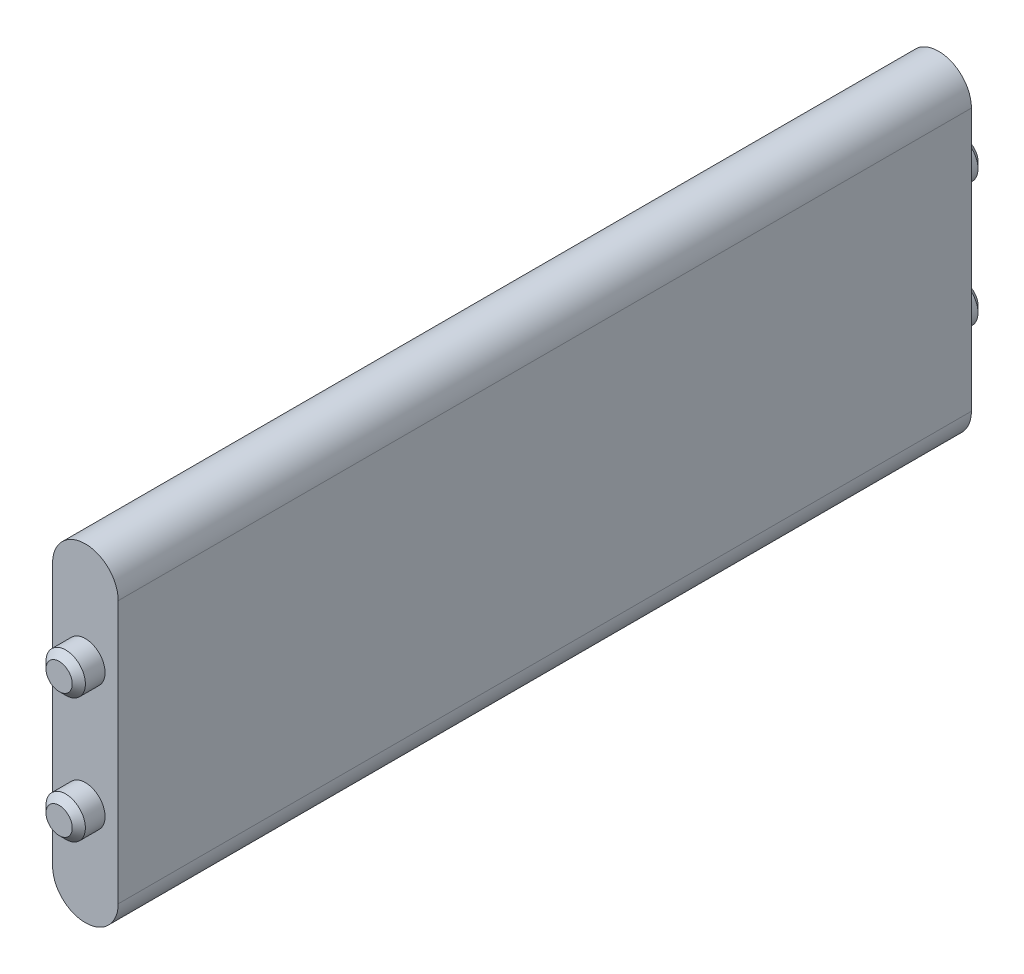
ISO-10303-21;
HEADER;
FILE_DESCRIPTION(('STEP AP214'),'2;1');
FILE_NAME('part.step','',(''),(''),'','','');
FILE_SCHEMA(('AUTOMOTIVE_DESIGN { 1 0 10303 214 1 1 1 1 }'));
ENDSEC;
DATA;
#1=APPLICATION_CONTEXT('core data for automotive mechanical design processes');
#2=APPLICATION_PROTOCOL_DEFINITION('international standard','automotive_design',2000,#1);
#3=PRODUCT_CONTEXT('',#1,'mechanical');
#4=PRODUCT('Part','Part','',(#3));
#5=PRODUCT_RELATED_PRODUCT_CATEGORY('part','',(#4));
#6=PRODUCT_DEFINITION_FORMATION('','',#4);
#7=PRODUCT_DEFINITION_CONTEXT('part definition',#1,'design');
#8=PRODUCT_DEFINITION('design','',#6,#7);
#9=PRODUCT_DEFINITION_SHAPE('','',#8);
#10=(LENGTH_UNIT() NAMED_UNIT(*) SI_UNIT(.MILLI.,.METRE.));
#11=(NAMED_UNIT(*) PLANE_ANGLE_UNIT() SI_UNIT($,.RADIAN.));
#12=(NAMED_UNIT(*) SI_UNIT($,.STERADIAN.) SOLID_ANGLE_UNIT());
#13=UNCERTAINTY_MEASURE_WITH_UNIT(LENGTH_MEASURE(1.E-05),#10,'distance_accuracy_value','');
#14=(GEOMETRIC_REPRESENTATION_CONTEXT(3) GLOBAL_UNCERTAINTY_ASSIGNED_CONTEXT((#13)) GLOBAL_UNIT_ASSIGNED_CONTEXT((#10,
#11,#12)) REPRESENTATION_CONTEXT('',''));
#15=CARTESIAN_POINT('',(0.,0.,0.));
#16=DIRECTION('',(0.,0.,1.));
#17=DIRECTION('',(1.,0.,0.));
#18=AXIS2_PLACEMENT_3D('',#15,#16,#17);
#19=CARTESIAN_POINT('',(0.,20.,65.));
#20=DIRECTION('',(0.,0.,-1.));
#21=DIRECTION('',(-1.,0.,0.));
#22=AXIS2_PLACEMENT_3D('',#19,#20,#21);
#23=PLANE('',#22);
#24=CARTESIAN_POINT('',(0.,9.5,65.));
#25=DIRECTION('',(0.,0.,-1.));
#26=DIRECTION('',(-1.,0.,0.));
#27=AXIS2_PLACEMENT_3D('',#24,#25,#26);
#28=CIRCLE('',#27,3.);
#29=CARTESIAN_POINT('',(-3.,9.5,65.));
#30=VERTEX_POINT('',#29);
#31=EDGE_CURVE('E107',#30,#30,#28,.F.);
#32=ORIENTED_EDGE('',*,*,#31,.F.);
#33=EDGE_LOOP('',(#32));
#34=FACE_BOUND('',#33,.T.);
#35=CARTESIAN_POINT('',(0.,20.,65.));
#36=DIRECTION('',(0.,0.,1.));
#37=DIRECTION('',(-1.,0.,0.));
#38=AXIS2_PLACEMENT_3D('',#35,#36,#37);
#39=CIRCLE('',#38,5.);
#40=CARTESIAN_POINT('',(5.,20.,65.));
#41=VERTEX_POINT('',#40);
#42=CARTESIAN_POINT('',(-5.,20.,65.));
#43=VERTEX_POINT('',#42);
#44=EDGE_CURVE('E83',#41,#43,#39,.T.);
#45=ORIENTED_EDGE('',*,*,#44,.T.);
#46=DIRECTION('',(0.,-1.,0.));
#47=VECTOR('',#46,1.);
#48=CARTESIAN_POINT('',(-5.,20.,65.));
#49=LINE('',#48,#47);
#50=CARTESIAN_POINT('',(-4.99999999999999,-20.,65.));
#51=VERTEX_POINT('',#50);
#52=EDGE_CURVE('E78',#43,#51,#49,.T.);
#53=ORIENTED_EDGE('',*,*,#52,.T.);
#54=CARTESIAN_POINT('',(0.,-20.,65.));
#55=DIRECTION('',(0.,0.,1.));
#56=DIRECTION('',(1.,0.,0.));
#57=AXIS2_PLACEMENT_3D('',#54,#55,#56);
#58=CIRCLE('',#57,5.);
#59=CARTESIAN_POINT('',(4.99999999999999,-20.,65.));
#60=VERTEX_POINT('',#59);
#61=EDGE_CURVE('E81',#51,#60,#58,.T.);
#62=ORIENTED_EDGE('',*,*,#61,.T.);
#63=DIRECTION('',(0.,1.,0.));
#64=VECTOR('',#63,1.);
#65=CARTESIAN_POINT('',(5.,20.,65.));
#66=LINE('',#65,#64);
#67=EDGE_CURVE('E47',#60,#41,#66,.T.);
#68=ORIENTED_EDGE('',*,*,#67,.T.);
#69=EDGE_LOOP('',(#45,#53,#62,#68));
#70=FACE_BOUND('',#69,.T.);
#71=CARTESIAN_POINT('',(0.,-9.5,65.));
#72=DIRECTION('',(0.,0.,-1.));
#73=DIRECTION('',(-1.,0.,0.));
#74=AXIS2_PLACEMENT_3D('',#71,#72,#73);
#75=CIRCLE('',#74,3.);
#76=CARTESIAN_POINT('',(-3.,-9.5,65.));
#77=VERTEX_POINT('',#76);
#78=EDGE_CURVE('E110',#77,#77,#75,.F.);
#79=ORIENTED_EDGE('',*,*,#78,.F.);
#80=EDGE_LOOP('',(#79));
#81=FACE_BOUND('',#80,.T.);
#82=ADVANCED_FACE('F30',(#34,#70,#81),#23,.F.);
#83=CARTESIAN_POINT('',(0.,20.,65.));
#84=DIRECTION('',(0.,0.,-1.));
#85=DIRECTION('',(-1.,0.,0.));
#86=AXIS2_PLACEMENT_3D('',#83,#84,#85);
#87=CYLINDRICAL_SURFACE('',#86,5.);
#88=CARTESIAN_POINT('',(0.,20.,-65.));
#89=DIRECTION('',(0.,0.,1.));
#90=DIRECTION('',(-1.,0.,0.));
#91=AXIS2_PLACEMENT_3D('',#88,#89,#90);
#92=CIRCLE('',#91,5.);
#93=CARTESIAN_POINT('',(5.,20.,-65.));
#94=VERTEX_POINT('',#93);
#95=CARTESIAN_POINT('',(-5.,20.,-65.));
#96=VERTEX_POINT('',#95);
#97=EDGE_CURVE('E98',#94,#96,#92,.T.);
#98=ORIENTED_EDGE('',*,*,#97,.T.);
#99=DIRECTION('',(0.,0.,-1.));
#100=VECTOR('',#99,1.);
#101=CARTESIAN_POINT('',(-5.,20.,65.));
#102=LINE('',#101,#100);
#103=EDGE_CURVE('E89',#43,#96,#102,.T.);
#104=ORIENTED_EDGE('',*,*,#103,.F.);
#105=ORIENTED_EDGE('',*,*,#44,.F.);
#106=DIRECTION('',(0.,0.,-1.));
#107=VECTOR('',#106,1.);
#108=CARTESIAN_POINT('',(5.,20.,65.));
#109=LINE('',#108,#107);
#110=EDGE_CURVE('E94',#41,#94,#109,.T.);
#111=ORIENTED_EDGE('',*,*,#110,.T.);
#112=EDGE_LOOP('',(#98,#104,#105,#111));
#113=FACE_BOUND('',#112,.T.);
#114=ADVANCED_FACE('F152',(#113),#87,.T.);
#115=CARTESIAN_POINT('',(-5.,20.,65.));
#116=DIRECTION('',(1.,0.,0.));
#117=DIRECTION('',(0.,1.,0.));
#118=AXIS2_PLACEMENT_3D('',#115,#116,#117);
#119=PLANE('',#118);
#120=DIRECTION('',(0.,-1.,0.));
#121=VECTOR('',#120,1.);
#122=CARTESIAN_POINT('',(-5.,20.,-65.));
#123=LINE('',#122,#121);
#124=CARTESIAN_POINT('',(-4.99999999999999,-20.,-65.));
#125=VERTEX_POINT('',#124);
#126=EDGE_CURVE('E88',#96,#125,#123,.T.);
#127=ORIENTED_EDGE('',*,*,#126,.T.);
#128=DIRECTION('',(0.,0.,-1.));
#129=VECTOR('',#128,1.);
#130=CARTESIAN_POINT('',(-4.99999999999999,-20.,65.));
#131=LINE('',#130,#129);
#132=EDGE_CURVE('E86',#51,#125,#131,.T.);
#133=ORIENTED_EDGE('',*,*,#132,.F.);
#134=ORIENTED_EDGE('',*,*,#52,.F.);
#135=ORIENTED_EDGE('',*,*,#103,.T.);
#136=EDGE_LOOP('',(#127,#133,#134,#135));
#137=FACE_BOUND('',#136,.T.);
#138=ADVANCED_FACE('F87',(#137),#119,.F.);
#139=CARTESIAN_POINT('',(0.,-20.,65.));
#140=DIRECTION('',(0.,0.,-1.));
#141=DIRECTION('',(-1.,0.,0.));
#142=AXIS2_PLACEMENT_3D('',#139,#140,#141);
#143=CYLINDRICAL_SURFACE('',#142,5.);
#144=CARTESIAN_POINT('',(0.,-20.,-65.));
#145=DIRECTION('',(0.,0.,1.));
#146=DIRECTION('',(1.,0.,0.));
#147=AXIS2_PLACEMENT_3D('',#144,#145,#146);
#148=CIRCLE('',#147,5.);
#149=CARTESIAN_POINT('',(4.99999999999999,-20.,-65.));
#150=VERTEX_POINT('',#149);
#151=EDGE_CURVE('E64',#125,#150,#148,.T.);
#152=ORIENTED_EDGE('',*,*,#151,.T.);
#153=DIRECTION('',(0.,0.,-1.));
#154=VECTOR('',#153,1.);
#155=CARTESIAN_POINT('',(4.99999999999999,-20.,65.));
#156=LINE('',#155,#154);
#157=EDGE_CURVE('E90',#60,#150,#156,.T.);
#158=ORIENTED_EDGE('',*,*,#157,.F.);
#159=ORIENTED_EDGE('',*,*,#61,.F.);
#160=ORIENTED_EDGE('',*,*,#132,.T.);
#161=EDGE_LOOP('',(#152,#158,#159,#160));
#162=FACE_BOUND('',#161,.T.);
#163=ADVANCED_FACE('F92',(#162),#143,.T.);
#164=CARTESIAN_POINT('',(5.,20.,65.));
#165=DIRECTION('',(-1.,0.,0.));
#166=DIRECTION('',(0.,-1.,0.));
#167=AXIS2_PLACEMENT_3D('',#164,#165,#166);
#168=PLANE('',#167);
#169=DIRECTION('',(0.,1.,0.));
#170=VECTOR('',#169,1.);
#171=CARTESIAN_POINT('',(5.,20.,-65.));
#172=LINE('',#171,#170);
#173=EDGE_CURVE('E70',#150,#94,#172,.T.);
#174=ORIENTED_EDGE('',*,*,#173,.T.);
#175=ORIENTED_EDGE('',*,*,#110,.F.);
#176=ORIENTED_EDGE('',*,*,#67,.F.);
#177=ORIENTED_EDGE('',*,*,#157,.T.);
#178=EDGE_LOOP('',(#174,#175,#176,#177));
#179=FACE_BOUND('',#178,.T.);
#180=ADVANCED_FACE('F168',(#179),#168,.F.);
#181=CARTESIAN_POINT('',(0.,20.,-65.));
#182=DIRECTION('',(0.,0.,-1.));
#183=DIRECTION('',(-1.,0.,0.));
#184=AXIS2_PLACEMENT_3D('',#181,#182,#183);
#185=PLANE('',#184);
#186=CARTESIAN_POINT('',(0.,-9.5,-65.));
#187=DIRECTION('',(0.,0.,-1.));
#188=DIRECTION('',(-1.,0.,0.));
#189=AXIS2_PLACEMENT_3D('',#186,#187,#188);
#190=CIRCLE('',#189,3.);
#191=CARTESIAN_POINT('',(-3.,-9.5,-65.));
#192=VERTEX_POINT('',#191);
#193=EDGE_CURVE('E128',#192,#192,#190,.T.);
#194=ORIENTED_EDGE('',*,*,#193,.F.);
#195=EDGE_LOOP('',(#194));
#196=FACE_BOUND('',#195,.T.);
#197=CARTESIAN_POINT('',(0.,9.5,-65.));
#198=DIRECTION('',(0.,0.,-1.));
#199=DIRECTION('',(-1.,0.,0.));
#200=AXIS2_PLACEMENT_3D('',#197,#198,#199);
#201=CIRCLE('',#200,3.);
#202=CARTESIAN_POINT('',(-3.,9.5,-65.));
#203=VERTEX_POINT('',#202);
#204=EDGE_CURVE('E125',#203,#203,#201,.T.);
#205=ORIENTED_EDGE('',*,*,#204,.F.);
#206=EDGE_LOOP('',(#205));
#207=FACE_BOUND('',#206,.T.);
#208=ORIENTED_EDGE('',*,*,#97,.F.);
#209=ORIENTED_EDGE('',*,*,#173,.F.);
#210=ORIENTED_EDGE('',*,*,#151,.F.);
#211=ORIENTED_EDGE('',*,*,#126,.F.);
#212=EDGE_LOOP('',(#208,#209,#210,#211));
#213=FACE_BOUND('',#212,.T.);
#214=ADVANCED_FACE('F165',(#196,#207,#213),#185,.T.);
#215=CARTESIAN_POINT('',(0.,9.5,69.));
#216=DIRECTION('',(0.,0.,-1.));
#217=DIRECTION('',(-1.,0.,0.));
#218=AXIS2_PLACEMENT_3D('',#215,#216,#217);
#219=CYLINDRICAL_SURFACE('',#218,3.);
#220=CARTESIAN_POINT('',(0.,9.5,68.));
#221=DIRECTION('',(0.,0.,1.));
#222=DIRECTION('',(1.,0.,0.));
#223=AXIS2_PLACEMENT_3D('',#220,#221,#222);
#224=CIRCLE('',#223,3.);
#225=CARTESIAN_POINT('',(3.,9.5,68.));
#226=VERTEX_POINT('',#225);
#227=EDGE_CURVE('E122',#226,#226,#224,.F.);
#228=ORIENTED_EDGE('',*,*,#227,.T.);
#229=EDGE_LOOP('',(#228));
#230=FACE_BOUND('',#229,.T.);
#231=ORIENTED_EDGE('',*,*,#31,.T.);
#232=EDGE_LOOP('',(#231));
#233=FACE_BOUND('',#232,.T.);
#234=ADVANCED_FACE('F163',(#230,#233),#219,.T.);
#235=CARTESIAN_POINT('',(0.,9.5,69.));
#236=DIRECTION('',(0.,0.,1.));
#237=DIRECTION('',(1.,0.,0.));
#238=AXIS2_PLACEMENT_3D('',#235,#236,#237);
#239=PLANE('',#238);
#240=CARTESIAN_POINT('',(0.,9.5,69.));
#241=DIRECTION('',(0.,0.,1.));
#242=DIRECTION('',(1.,0.,0.));
#243=AXIS2_PLACEMENT_3D('',#240,#241,#242);
#244=CIRCLE('',#243,2.00000000000002);
#245=CARTESIAN_POINT('',(2.00000000000002,9.5,69.));
#246=VERTEX_POINT('',#245);
#247=EDGE_CURVE('E119',#246,#246,#244,.T.);
#248=ORIENTED_EDGE('',*,*,#247,.T.);
#249=EDGE_LOOP('',(#248));
#250=FACE_BOUND('',#249,.T.);
#251=ADVANCED_FACE('F193',(#250),#239,.T.);
#252=CARTESIAN_POINT('',(0.,-9.5,69.));
#253=DIRECTION('',(0.,0.,-1.));
#254=DIRECTION('',(-1.,0.,0.));
#255=AXIS2_PLACEMENT_3D('',#252,#253,#254);
#256=CYLINDRICAL_SURFACE('',#255,3.);
#257=CARTESIAN_POINT('',(0.,-9.5,68.));
#258=DIRECTION('',(0.,0.,-1.));
#259=DIRECTION('',(-1.,0.,0.));
#260=AXIS2_PLACEMENT_3D('',#257,#258,#259);
#261=CIRCLE('',#260,3.);
#262=CARTESIAN_POINT('',(-3.,-9.5,68.));
#263=VERTEX_POINT('',#262);
#264=EDGE_CURVE('E116',#263,#263,#261,.T.);
#265=ORIENTED_EDGE('',*,*,#264,.T.);
#266=EDGE_LOOP('',(#265));
#267=FACE_BOUND('',#266,.T.);
#268=ORIENTED_EDGE('',*,*,#78,.T.);
#269=EDGE_LOOP('',(#268));
#270=FACE_BOUND('',#269,.T.);
#271=ADVANCED_FACE('F195',(#267,#270),#256,.T.);
#272=CARTESIAN_POINT('',(0.,-9.5,69.));
#273=DIRECTION('',(0.,0.,-1.));
#274=DIRECTION('',(-1.,0.,0.));
#275=AXIS2_PLACEMENT_3D('',#272,#273,#274);
#276=PLANE('',#275);
#277=CARTESIAN_POINT('',(0.,-9.5,69.));
#278=DIRECTION('',(0.,0.,-1.));
#279=DIRECTION('',(-1.,0.,0.));
#280=AXIS2_PLACEMENT_3D('',#277,#278,#279);
#281=CIRCLE('',#280,2.00000000000002);
#282=CARTESIAN_POINT('',(-2.00000000000002,-9.5,69.));
#283=VERTEX_POINT('',#282);
#284=EDGE_CURVE('E113',#283,#283,#281,.F.);
#285=ORIENTED_EDGE('',*,*,#284,.T.);
#286=EDGE_LOOP('',(#285));
#287=FACE_BOUND('',#286,.T.);
#288=ADVANCED_FACE('F180',(#287),#276,.F.);
#289=CARTESIAN_POINT('',(0.,-9.5,69.));
#290=DIRECTION('',(0.,0.,-1.));
#291=DIRECTION('',(-1.,0.,0.));
#292=AXIS2_PLACEMENT_3D('',#289,#290,#291);
#293=CONICAL_SURFACE('',#292,2.00000000000002,0.785398163397447);
#294=ORIENTED_EDGE('',*,*,#264,.F.);
#295=EDGE_LOOP('',(#294));
#296=FACE_BOUND('',#295,.T.);
#297=ORIENTED_EDGE('',*,*,#284,.F.);
#298=EDGE_LOOP('',(#297));
#299=FACE_BOUND('',#298,.T.);
#300=ADVANCED_FACE('F176',(#296,#299),#293,.T.);
#301=CARTESIAN_POINT('',(0.,9.5,69.));
#302=DIRECTION('',(0.,0.,-1.));
#303=DIRECTION('',(-1.,0.,0.));
#304=AXIS2_PLACEMENT_3D('',#301,#302,#303);
#305=CONICAL_SURFACE('',#304,2.00000000000002,0.785398163397447);
#306=ORIENTED_EDGE('',*,*,#227,.F.);
#307=EDGE_LOOP('',(#306));
#308=FACE_BOUND('',#307,.T.);
#309=ORIENTED_EDGE('',*,*,#247,.F.);
#310=EDGE_LOOP('',(#309));
#311=FACE_BOUND('',#310,.T.);
#312=ADVANCED_FACE('F179',(#308,#311),#305,.T.);
#313=CARTESIAN_POINT('',(0.,9.5,-69.));
#314=DIRECTION('',(0.,0.,1.));
#315=DIRECTION('',(1.,0.,0.));
#316=AXIS2_PLACEMENT_3D('',#313,#314,#315);
#317=CYLINDRICAL_SURFACE('',#316,3.);
#318=CARTESIAN_POINT('',(0.,9.5,-68.));
#319=DIRECTION('',(0.,0.,-1.));
#320=DIRECTION('',(-1.,0.,0.));
#321=AXIS2_PLACEMENT_3D('',#318,#319,#320);
#322=CIRCLE('',#321,3.);
#323=CARTESIAN_POINT('',(-3.,9.5,-68.));
#324=VERTEX_POINT('',#323);
#325=EDGE_CURVE('E39',#324,#324,#322,.F.);
#326=ORIENTED_EDGE('',*,*,#325,.T.);
#327=EDGE_LOOP('',(#326));
#328=FACE_BOUND('',#327,.T.);
#329=ORIENTED_EDGE('',*,*,#204,.T.);
#330=EDGE_LOOP('',(#329));
#331=FACE_BOUND('',#330,.T.);
#332=ADVANCED_FACE('F139',(#328,#331),#317,.T.);
#333=CARTESIAN_POINT('',(0.,9.5,-69.));
#334=DIRECTION('',(0.,0.,-1.));
#335=DIRECTION('',(1.,0.,0.));
#336=AXIS2_PLACEMENT_3D('',#333,#334,#335);
#337=PLANE('',#336);
#338=CARTESIAN_POINT('',(0.,9.5,-69.));
#339=DIRECTION('',(0.,0.,-1.));
#340=DIRECTION('',(-1.,0.,0.));
#341=AXIS2_PLACEMENT_3D('',#338,#339,#340);
#342=CIRCLE('',#341,1.99999999999999);
#343=CARTESIAN_POINT('',(-1.99999999999999,9.5,-69.));
#344=VERTEX_POINT('',#343);
#345=EDGE_CURVE('E11',#344,#344,#342,.T.);
#346=ORIENTED_EDGE('',*,*,#345,.T.);
#347=EDGE_LOOP('',(#346));
#348=FACE_BOUND('',#347,.T.);
#349=ADVANCED_FACE('F187',(#348),#337,.T.);
#350=CARTESIAN_POINT('',(0.,-9.5,-69.));
#351=DIRECTION('',(0.,0.,1.));
#352=DIRECTION('',(1.,0.,0.));
#353=AXIS2_PLACEMENT_3D('',#350,#351,#352);
#354=CYLINDRICAL_SURFACE('',#353,3.);
#355=CARTESIAN_POINT('',(0.,-9.5,-68.));
#356=DIRECTION('',(0.,0.,1.));
#357=DIRECTION('',(1.,0.,0.));
#358=AXIS2_PLACEMENT_3D('',#355,#356,#357);
#359=CIRCLE('',#358,3.);
#360=CARTESIAN_POINT('',(3.,-9.5,-68.));
#361=VERTEX_POINT('',#360);
#362=EDGE_CURVE('E131',#361,#361,#359,.T.);
#363=ORIENTED_EDGE('',*,*,#362,.T.);
#364=EDGE_LOOP('',(#363));
#365=FACE_BOUND('',#364,.T.);
#366=ORIENTED_EDGE('',*,*,#193,.T.);
#367=EDGE_LOOP('',(#366));
#368=FACE_BOUND('',#367,.T.);
#369=ADVANCED_FACE('F209',(#365,#368),#354,.T.);
#370=CARTESIAN_POINT('',(0.,-9.5,-69.));
#371=DIRECTION('',(0.,0.,1.));
#372=DIRECTION('',(-1.,0.,0.));
#373=AXIS2_PLACEMENT_3D('',#370,#371,#372);
#374=PLANE('',#373);
#375=CARTESIAN_POINT('',(0.,-9.5,-69.));
#376=DIRECTION('',(0.,0.,1.));
#377=DIRECTION('',(1.,0.,0.));
#378=AXIS2_PLACEMENT_3D('',#375,#376,#377);
#379=CIRCLE('',#378,1.99999999999999);
#380=CARTESIAN_POINT('',(1.99999999999999,-9.5,-69.));
#381=VERTEX_POINT('',#380);
#382=EDGE_CURVE('E134',#381,#381,#379,.F.);
#383=ORIENTED_EDGE('',*,*,#382,.T.);
#384=EDGE_LOOP('',(#383));
#385=FACE_BOUND('',#384,.T.);
#386=ADVANCED_FACE('F148',(#385),#374,.F.);
#387=CARTESIAN_POINT('',(0.,-9.5,-68.));
#388=DIRECTION('',(0.,0.,1.));
#389=DIRECTION('',(1.,0.,0.));
#390=AXIS2_PLACEMENT_3D('',#387,#388,#389);
#391=CONICAL_SURFACE('',#390,3.,0.785398163397445);
#392=ORIENTED_EDGE('',*,*,#382,.F.);
#393=EDGE_LOOP('',(#392));
#394=FACE_BOUND('',#393,.T.);
#395=ORIENTED_EDGE('',*,*,#362,.F.);
#396=EDGE_LOOP('',(#395));
#397=FACE_BOUND('',#396,.T.);
#398=ADVANCED_FACE('F143',(#394,#397),#391,.T.);
#399=CARTESIAN_POINT('',(0.,9.5,-68.));
#400=DIRECTION('',(0.,0.,1.));
#401=DIRECTION('',(1.,0.,0.));
#402=AXIS2_PLACEMENT_3D('',#399,#400,#401);
#403=CONICAL_SURFACE('',#402,3.,0.785398163397445);
#404=ORIENTED_EDGE('',*,*,#345,.F.);
#405=EDGE_LOOP('',(#404));
#406=FACE_BOUND('',#405,.T.);
#407=ORIENTED_EDGE('',*,*,#325,.F.);
#408=EDGE_LOOP('',(#407));
#409=FACE_BOUND('',#408,.T.);
#410=ADVANCED_FACE('F32',(#406,#409),#403,.T.);
#411=CLOSED_SHELL('',(#82,#114,#138,#163,#180,#214,#234,#251,#271,#288,#300,#312,#332,#349,#369,
#386,#398,#410));
#412=MANIFOLD_SOLID_BREP('B2',#411);
#413=ADVANCED_BREP_SHAPE_REPRESENTATION('',(#18,#412),#14);
#414=SHAPE_DEFINITION_REPRESENTATION(#9,#413);
ENDSEC;
END-ISO-10303-21;
